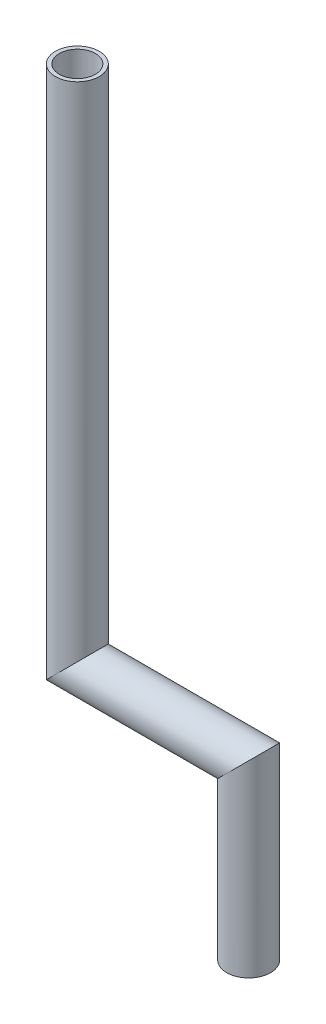
ISO-10303-21;
HEADER;
FILE_DESCRIPTION(('STEP AP214'),'2;1');
FILE_NAME('part.step','',(''),(''),'','','');
FILE_SCHEMA(('AUTOMOTIVE_DESIGN { 1 0 10303 214 1 1 1 1 }'));
ENDSEC;
DATA;
#1=APPLICATION_CONTEXT('core data for automotive mechanical design processes');
#2=APPLICATION_PROTOCOL_DEFINITION('international standard','automotive_design',2000,#1);
#3=PRODUCT_CONTEXT('',#1,'mechanical');
#4=PRODUCT('Part','Part','',(#3));
#5=PRODUCT_RELATED_PRODUCT_CATEGORY('part','',(#4));
#6=PRODUCT_DEFINITION_FORMATION('','',#4);
#7=PRODUCT_DEFINITION_CONTEXT('part definition',#1,'design');
#8=PRODUCT_DEFINITION('design','',#6,#7);
#9=PRODUCT_DEFINITION_SHAPE('','',#8);
#10=(LENGTH_UNIT() NAMED_UNIT(*) SI_UNIT(.MILLI.,.METRE.));
#11=(NAMED_UNIT(*) PLANE_ANGLE_UNIT() SI_UNIT($,.RADIAN.));
#12=(NAMED_UNIT(*) SI_UNIT($,.STERADIAN.) SOLID_ANGLE_UNIT());
#13=UNCERTAINTY_MEASURE_WITH_UNIT(LENGTH_MEASURE(1.E-05),#10,'distance_accuracy_value','');
#14=(GEOMETRIC_REPRESENTATION_CONTEXT(3) GLOBAL_UNCERTAINTY_ASSIGNED_CONTEXT((#13)) GLOBAL_UNIT_ASSIGNED_CONTEXT((#10,
#11,#12)) REPRESENTATION_CONTEXT('',''));
#15=CARTESIAN_POINT('',(0.,0.,0.));
#16=DIRECTION('',(0.,0.,1.));
#17=DIRECTION('',(1.,0.,0.));
#18=AXIS2_PLACEMENT_3D('',#15,#16,#17);
#19=CARTESIAN_POINT('',(99.2439782695199,0.,0.));
#20=DIRECTION('',(0.,-1.,0.));
#21=DIRECTION('',(0.,0.,-1.));
#22=AXIS2_PLACEMENT_3D('',#19,#20,#21);
#23=CYLINDRICAL_SURFACE('',#22,10.4582557584075);
#24=CARTESIAN_POINT('',(99.2439782695199,0.,0.));
#25=DIRECTION('',(0.707106781186548,-0.707106781186548,0.));
#26=DIRECTION('',(0.707106781186548,0.707106781186548,0.));
#27=AXIS2_PLACEMENT_3D('',#24,#25,#26);
#28=ELLIPSE('',#27,14.7902071323064,10.4582557584075);
#29=CARTESIAN_POINT('',(109.702234027927,10.4582557584075,0.));
#30=VERTEX_POINT('',#29);
#31=EDGE_CURVE('E49',#30,#30,#28,.T.);
#32=ORIENTED_EDGE('',*,*,#31,.F.);
#33=EDGE_LOOP('',(#32));
#34=FACE_BOUND('',#33,.T.);
#35=CARTESIAN_POINT('',(99.2439782695199,-100.,0.));
#36=DIRECTION('',(0.,-1.,0.));
#37=DIRECTION('',(0.,0.,-1.));
#38=AXIS2_PLACEMENT_3D('',#35,#36,#37);
#39=CIRCLE('',#38,10.4582557584075);
#40=CARTESIAN_POINT('',(99.2439782695199,-100.,-10.4582557584075));
#41=VERTEX_POINT('',#40);
#42=EDGE_CURVE('E11',#41,#41,#39,.F.);
#43=ORIENTED_EDGE('',*,*,#42,.F.);
#44=EDGE_LOOP('',(#43));
#45=FACE_BOUND('',#44,.T.);
#46=ADVANCED_FACE('F33',(#34,#45),#23,.F.);
#47=CARTESIAN_POINT('',(99.2439782695199,0.,0.));
#48=DIRECTION('',(0.,-1.,0.));
#49=DIRECTION('',(0.,0.,-1.));
#50=AXIS2_PLACEMENT_3D('',#47,#48,#49);
#51=CYLINDRICAL_SURFACE('',#50,12.7);
#52=CARTESIAN_POINT('',(99.2439782695199,0.,0.));
#53=DIRECTION('',(0.707106781186548,-0.707106781186548,0.));
#54=DIRECTION('',(0.707106781186548,0.707106781186548,0.));
#55=AXIS2_PLACEMENT_3D('',#52,#53,#54);
#56=ELLIPSE('',#55,17.9605122421383,12.7);
#57=CARTESIAN_POINT('',(111.94397826952,12.7,0.));
#58=VERTEX_POINT('',#57);
#59=EDGE_CURVE('E45',#58,#58,#56,.T.);
#60=ORIENTED_EDGE('',*,*,#59,.T.);
#61=EDGE_LOOP('',(#60));
#62=FACE_BOUND('',#61,.T.);
#63=CARTESIAN_POINT('',(99.2439782695199,-100.,0.));
#64=DIRECTION('',(0.,-1.,0.));
#65=DIRECTION('',(0.,0.,-1.));
#66=AXIS2_PLACEMENT_3D('',#63,#64,#65);
#67=CIRCLE('',#66,12.7);
#68=CARTESIAN_POINT('',(99.2439782695199,-100.,-12.7));
#69=VERTEX_POINT('',#68);
#70=EDGE_CURVE('E37',#69,#69,#67,.F.);
#71=ORIENTED_EDGE('',*,*,#70,.T.);
#72=EDGE_LOOP('',(#71));
#73=FACE_BOUND('',#72,.T.);
#74=ADVANCED_FACE('F35',(#62,#73),#51,.T.);
#75=CARTESIAN_POINT('',(0.,0.,0.));
#76=DIRECTION('',(1.,0.,0.));
#77=DIRECTION('',(0.,0.,-1.));
#78=AXIS2_PLACEMENT_3D('',#75,#76,#77);
#79=CYLINDRICAL_SURFACE('',#78,12.7);
#80=CARTESIAN_POINT('',(0.,0.,0.));
#81=DIRECTION('',(0.707106781186548,-0.707106781186548,0.));
#82=DIRECTION('',(0.707106781186548,0.707106781186548,0.));
#83=AXIS2_PLACEMENT_3D('',#80,#81,#82);
#84=ELLIPSE('',#83,17.9605122421383,12.7);
#85=CARTESIAN_POINT('',(12.7,12.7,0.));
#86=VERTEX_POINT('',#85);
#87=EDGE_CURVE('E53',#86,#86,#84,.F.);
#88=ORIENTED_EDGE('',*,*,#87,.F.);
#89=EDGE_LOOP('',(#88));
#90=FACE_BOUND('',#89,.T.);
#91=ORIENTED_EDGE('',*,*,#59,.F.);
#92=EDGE_LOOP('',(#91));
#93=FACE_BOUND('',#92,.T.);
#94=ADVANCED_FACE('F71',(#90,#93),#79,.T.);
#95=CARTESIAN_POINT('',(0.,0.,0.));
#96=DIRECTION('',(1.,0.,0.));
#97=DIRECTION('',(0.,0.,-1.));
#98=AXIS2_PLACEMENT_3D('',#95,#96,#97);
#99=CYLINDRICAL_SURFACE('',#98,10.4582557584075);
#100=CARTESIAN_POINT('',(0.,0.,0.));
#101=DIRECTION('',(0.707106781186548,-0.707106781186548,0.));
#102=DIRECTION('',(0.707106781186548,0.707106781186548,0.));
#103=AXIS2_PLACEMENT_3D('',#100,#101,#102);
#104=ELLIPSE('',#103,14.7902071323064,10.4582557584075);
#105=CARTESIAN_POINT('',(10.4582557584075,10.4582557584075,0.));
#106=VERTEX_POINT('',#105);
#107=EDGE_CURVE('E50',#106,#106,#104,.F.);
#108=ORIENTED_EDGE('',*,*,#107,.T.);
#109=EDGE_LOOP('',(#108));
#110=FACE_BOUND('',#109,.T.);
#111=ORIENTED_EDGE('',*,*,#31,.T.);
#112=EDGE_LOOP('',(#111));
#113=FACE_BOUND('',#112,.T.);
#114=ADVANCED_FACE('F64',(#110,#113),#99,.F.);
#115=CARTESIAN_POINT('',(0.,-35.9210244842766,0.));
#116=DIRECTION('',(0.,1.,0.));
#117=DIRECTION('',(0.,0.,1.));
#118=AXIS2_PLACEMENT_3D('',#115,#116,#117);
#119=CYLINDRICAL_SURFACE('',#118,10.4582557584075);
#120=CARTESIAN_POINT('',(0.,300.,0.));
#121=DIRECTION('',(0.,1.,0.));
#122=DIRECTION('',(0.,0.,1.));
#123=AXIS2_PLACEMENT_3D('',#120,#121,#122);
#124=CIRCLE('',#123,10.4582557584075);
#125=CARTESIAN_POINT('',(0.,300.,10.4582557584075));
#126=VERTEX_POINT('',#125);
#127=EDGE_CURVE('E54',#126,#126,#124,.T.);
#128=ORIENTED_EDGE('',*,*,#127,.T.);
#129=EDGE_LOOP('',(#128));
#130=FACE_BOUND('',#129,.T.);
#131=ORIENTED_EDGE('',*,*,#107,.F.);
#132=EDGE_LOOP('',(#131));
#133=FACE_BOUND('',#132,.T.);
#134=ADVANCED_FACE('F76',(#130,#133),#119,.F.);
#135=CARTESIAN_POINT('',(0.,300.,0.));
#136=DIRECTION('',(0.,1.,0.));
#137=DIRECTION('',(0.,0.,1.));
#138=AXIS2_PLACEMENT_3D('',#135,#136,#137);
#139=PLANE('',#138);
#140=ORIENTED_EDGE('',*,*,#127,.F.);
#141=EDGE_LOOP('',(#140));
#142=FACE_BOUND('',#141,.T.);
#143=CARTESIAN_POINT('',(0.,300.,0.));
#144=DIRECTION('',(0.,1.,0.));
#145=DIRECTION('',(0.,0.,1.));
#146=AXIS2_PLACEMENT_3D('',#143,#144,#145);
#147=CIRCLE('',#146,12.7);
#148=CARTESIAN_POINT('',(0.,300.,12.7));
#149=VERTEX_POINT('',#148);
#150=EDGE_CURVE('E57',#149,#149,#147,.T.);
#151=ORIENTED_EDGE('',*,*,#150,.T.);
#152=EDGE_LOOP('',(#151));
#153=FACE_BOUND('',#152,.T.);
#154=ADVANCED_FACE('F83',(#142,#153),#139,.T.);
#155=CARTESIAN_POINT('',(0.,-35.9210244842766,0.));
#156=DIRECTION('',(0.,1.,0.));
#157=DIRECTION('',(0.,0.,1.));
#158=AXIS2_PLACEMENT_3D('',#155,#156,#157);
#159=CYLINDRICAL_SURFACE('',#158,12.7);
#160=ORIENTED_EDGE('',*,*,#150,.F.);
#161=EDGE_LOOP('',(#160));
#162=FACE_BOUND('',#161,.T.);
#163=ORIENTED_EDGE('',*,*,#87,.T.);
#164=EDGE_LOOP('',(#163));
#165=FACE_BOUND('',#164,.T.);
#166=ADVANCED_FACE('F85',(#162,#165),#159,.T.);
#167=CARTESIAN_POINT('',(99.2439782695199,-100.,0.));
#168=DIRECTION('',(0.,-1.,0.));
#169=DIRECTION('',(0.,0.,-1.));
#170=AXIS2_PLACEMENT_3D('',#167,#168,#169);
#171=PLANE('',#170);
#172=ORIENTED_EDGE('',*,*,#70,.F.);
#173=EDGE_LOOP('',(#172));
#174=FACE_BOUND('',#173,.T.);
#175=ORIENTED_EDGE('',*,*,#42,.T.);
#176=EDGE_LOOP('',(#175));
#177=FACE_BOUND('',#176,.T.);
#178=ADVANCED_FACE('F88',(#174,#177),#171,.T.);
#179=CLOSED_SHELL('',(#46,#74,#94,#114,#134,#154,#166,#178));
#180=MANIFOLD_SOLID_BREP('B2',#179);
#181=ADVANCED_BREP_SHAPE_REPRESENTATION('',(#18,#180),#14);
#182=SHAPE_DEFINITION_REPRESENTATION(#9,#181);
ENDSEC;
END-ISO-10303-21;
